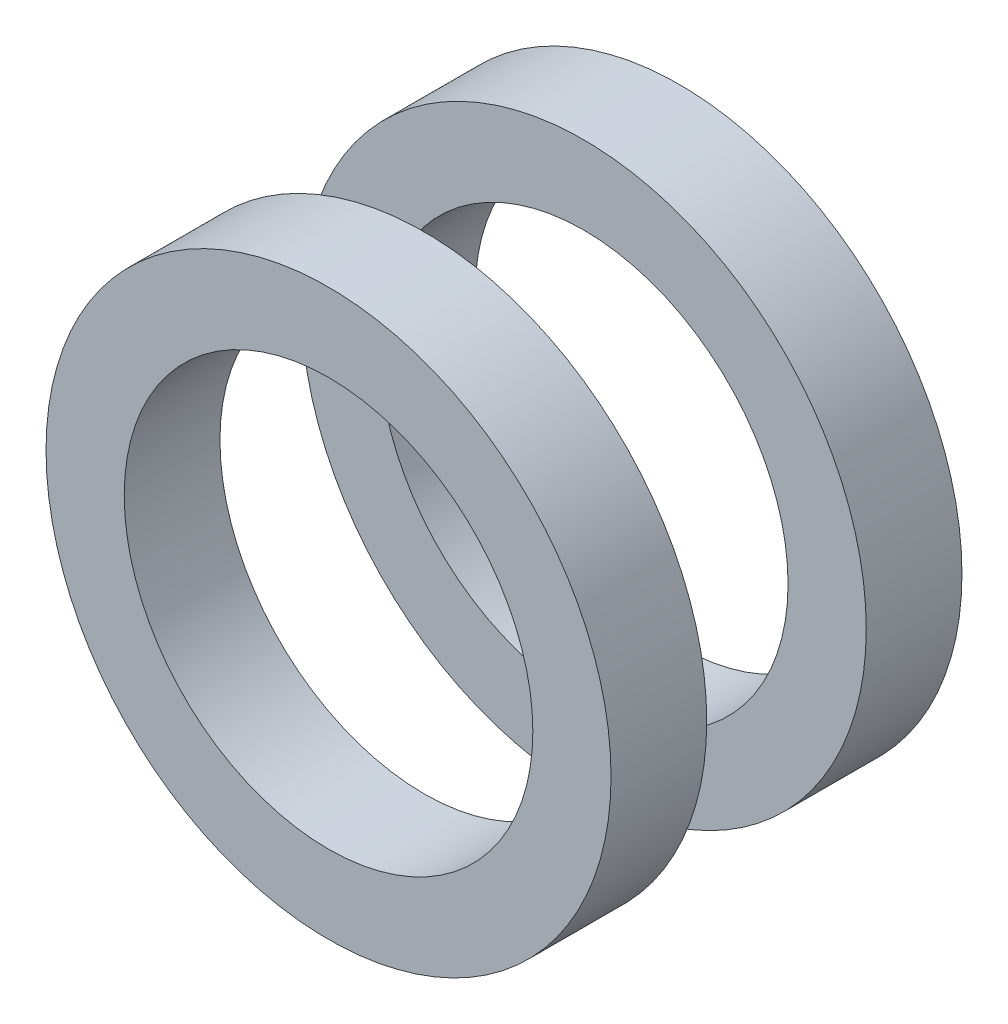
ISO-10303-21;
HEADER;
FILE_DESCRIPTION(('STEP AP214'),'2;1');
FILE_NAME('part.step','',(''),(''),'','','');
FILE_SCHEMA(('AUTOMOTIVE_DESIGN { 1 0 10303 214 1 1 1 1 }'));
ENDSEC;
DATA;
#1=APPLICATION_CONTEXT('core data for automotive mechanical design processes');
#2=APPLICATION_PROTOCOL_DEFINITION('international standard','automotive_design',2000,#1);
#3=PRODUCT_CONTEXT('',#1,'mechanical');
#4=PRODUCT('Part','Part','',(#3));
#5=PRODUCT_RELATED_PRODUCT_CATEGORY('part','',(#4));
#6=PRODUCT_DEFINITION_FORMATION('','',#4);
#7=PRODUCT_DEFINITION_CONTEXT('part definition',#1,'design');
#8=PRODUCT_DEFINITION('design','',#6,#7);
#9=PRODUCT_DEFINITION_SHAPE('','',#8);
#10=(LENGTH_UNIT() NAMED_UNIT(*) SI_UNIT(.MILLI.,.METRE.));
#11=(NAMED_UNIT(*) PLANE_ANGLE_UNIT() SI_UNIT($,.RADIAN.));
#12=(NAMED_UNIT(*) SI_UNIT($,.STERADIAN.) SOLID_ANGLE_UNIT());
#13=UNCERTAINTY_MEASURE_WITH_UNIT(LENGTH_MEASURE(1.E-05),#10,'distance_accuracy_value','');
#14=(GEOMETRIC_REPRESENTATION_CONTEXT(3) GLOBAL_UNCERTAINTY_ASSIGNED_CONTEXT((#13)) GLOBAL_UNIT_ASSIGNED_CONTEXT((#10,
#11,#12)) REPRESENTATION_CONTEXT('',''));
#15=CARTESIAN_POINT('',(0.,0.,0.));
#16=DIRECTION('',(0.,0.,1.));
#17=DIRECTION('',(1.,0.,0.));
#18=AXIS2_PLACEMENT_3D('',#15,#16,#17);
#19=CARTESIAN_POINT('',(0.,0.,-15.));
#20=DIRECTION('',(0.,0.,1.));
#21=DIRECTION('',(1.,0.,0.));
#22=AXIS2_PLACEMENT_3D('',#19,#20,#21);
#23=PLANE('',#22);
#24=CARTESIAN_POINT('',(0.,0.,-15.));
#25=DIRECTION('',(0.,0.,1.));
#26=DIRECTION('',(1.,0.,0.));
#27=AXIS2_PLACEMENT_3D('',#24,#25,#26);
#28=CIRCLE('',#27,53.1307692307692);
#29=CARTESIAN_POINT('',(53.1307692307692,0.,-15.));
#30=VERTEX_POINT('',#29);
#31=EDGE_CURVE('E11',#30,#30,#28,.T.);
#32=ORIENTED_EDGE('',*,*,#31,.T.);
#33=EDGE_LOOP('',(#32));
#34=FACE_BOUND('',#33,.T.);
#35=CARTESIAN_POINT('',(0.,0.,-15.));
#36=DIRECTION('',(0.,0.,1.));
#37=DIRECTION('',(1.,0.,0.));
#38=AXIS2_PLACEMENT_3D('',#35,#36,#37);
#39=CIRCLE('',#38,38.4230769230769);
#40=CARTESIAN_POINT('',(38.4230769230769,0.,-15.));
#41=VERTEX_POINT('',#40);
#42=EDGE_CURVE('E54',#41,#41,#39,.T.);
#43=ORIENTED_EDGE('',*,*,#42,.F.);
#44=EDGE_LOOP('',(#43));
#45=FACE_BOUND('',#44,.T.);
#46=ADVANCED_FACE('F43',(#34,#45),#23,.T.);
#47=CARTESIAN_POINT('',(0.,0.,-33.));
#48=DIRECTION('',(0.,0.,1.));
#49=DIRECTION('',(1.,0.,0.));
#50=AXIS2_PLACEMENT_3D('',#47,#48,#49);
#51=PLANE('',#50);
#52=CARTESIAN_POINT('',(0.,0.,-33.));
#53=DIRECTION('',(0.,0.,1.));
#54=DIRECTION('',(1.,0.,0.));
#55=AXIS2_PLACEMENT_3D('',#52,#53,#54);
#56=CIRCLE('',#55,53.1307692307692);
#57=CARTESIAN_POINT('',(53.1307692307692,0.,-33.));
#58=VERTEX_POINT('',#57);
#59=EDGE_CURVE('E47',#58,#58,#56,.T.);
#60=ORIENTED_EDGE('',*,*,#59,.F.);
#61=EDGE_LOOP('',(#60));
#62=FACE_BOUND('',#61,.T.);
#63=CARTESIAN_POINT('',(0.,0.,-33.));
#64=DIRECTION('',(0.,0.,1.));
#65=DIRECTION('',(1.,0.,0.));
#66=AXIS2_PLACEMENT_3D('',#63,#64,#65);
#67=CIRCLE('',#66,38.4230769230769);
#68=CARTESIAN_POINT('',(38.4230769230769,0.,-33.));
#69=VERTEX_POINT('',#68);
#70=EDGE_CURVE('E56',#69,#69,#67,.T.);
#71=ORIENTED_EDGE('',*,*,#70,.T.);
#72=EDGE_LOOP('',(#71));
#73=FACE_BOUND('',#72,.T.);
#74=ADVANCED_FACE('F66',(#62,#73),#51,.F.);
#75=CARTESIAN_POINT('',(0.,0.,-15.));
#76=DIRECTION('',(0.,0.,-1.));
#77=DIRECTION('',(-1.,0.,0.));
#78=AXIS2_PLACEMENT_3D('',#75,#76,#77);
#79=CYLINDRICAL_SURFACE('',#78,53.1307692307692);
#80=ORIENTED_EDGE('',*,*,#31,.F.);
#81=EDGE_LOOP('',(#80));
#82=FACE_BOUND('',#81,.T.);
#83=ORIENTED_EDGE('',*,*,#59,.T.);
#84=EDGE_LOOP('',(#83));
#85=FACE_BOUND('',#84,.T.);
#86=ADVANCED_FACE('F45',(#82,#85),#79,.T.);
#87=CARTESIAN_POINT('',(0.,0.,-15.));
#88=DIRECTION('',(0.,0.,-1.));
#89=DIRECTION('',(-1.,0.,0.));
#90=AXIS2_PLACEMENT_3D('',#87,#88,#89);
#91=CYLINDRICAL_SURFACE('',#90,38.4230769230769);
#92=ORIENTED_EDGE('',*,*,#42,.T.);
#93=EDGE_LOOP('',(#92));
#94=FACE_BOUND('',#93,.T.);
#95=ORIENTED_EDGE('',*,*,#70,.F.);
#96=EDGE_LOOP('',(#95));
#97=FACE_BOUND('',#96,.T.);
#98=ADVANCED_FACE('F62',(#94,#97),#91,.F.);
#99=CLOSED_SHELL('',(#46,#74,#86,#98));
#100=MANIFOLD_SOLID_BREP('B2',#99);
#101=CARTESIAN_POINT('',(0.,0.,33.));
#102=DIRECTION('',(0.,0.,1.));
#103=DIRECTION('',(1.,0.,0.));
#104=AXIS2_PLACEMENT_3D('',#101,#102,#103);
#105=PLANE('',#104);
#106=CARTESIAN_POINT('',(0.,0.,33.));
#107=DIRECTION('',(0.,0.,1.));
#108=DIRECTION('',(1.,0.,0.));
#109=AXIS2_PLACEMENT_3D('',#106,#107,#108);
#110=CIRCLE('',#109,53.1307692307692);
#111=CARTESIAN_POINT('',(53.1307692307692,0.,33.));
#112=VERTEX_POINT('',#111);
#113=EDGE_CURVE('E42',#112,#112,#110,.T.);
#114=ORIENTED_EDGE('',*,*,#113,.T.);
#115=EDGE_LOOP('',(#114));
#116=FACE_BOUND('',#115,.T.);
#117=CARTESIAN_POINT('',(0.,0.,33.));
#118=DIRECTION('',(0.,0.,1.));
#119=DIRECTION('',(1.,0.,0.));
#120=AXIS2_PLACEMENT_3D('',#117,#118,#119);
#121=CIRCLE('',#120,38.4230769230769);
#122=CARTESIAN_POINT('',(38.4230769230769,0.,33.));
#123=VERTEX_POINT('',#122);
#124=EDGE_CURVE('E116',#123,#123,#121,.T.);
#125=ORIENTED_EDGE('',*,*,#124,.F.);
#126=EDGE_LOOP('',(#125));
#127=FACE_BOUND('',#126,.T.);
#128=ADVANCED_FACE('F105',(#116,#127),#105,.T.);
#129=CARTESIAN_POINT('',(0.,0.,15.));
#130=DIRECTION('',(0.,0.,1.));
#131=DIRECTION('',(1.,0.,0.));
#132=AXIS2_PLACEMENT_3D('',#129,#130,#131);
#133=PLANE('',#132);
#134=CARTESIAN_POINT('',(0.,0.,15.));
#135=DIRECTION('',(0.,0.,1.));
#136=DIRECTION('',(1.,0.,0.));
#137=AXIS2_PLACEMENT_3D('',#134,#135,#136);
#138=CIRCLE('',#137,53.1307692307692);
#139=CARTESIAN_POINT('',(53.1307692307692,0.,15.));
#140=VERTEX_POINT('',#139);
#141=EDGE_CURVE('E109',#140,#140,#138,.T.);
#142=ORIENTED_EDGE('',*,*,#141,.F.);
#143=EDGE_LOOP('',(#142));
#144=FACE_BOUND('',#143,.T.);
#145=CARTESIAN_POINT('',(0.,0.,15.));
#146=DIRECTION('',(0.,0.,1.));
#147=DIRECTION('',(1.,0.,0.));
#148=AXIS2_PLACEMENT_3D('',#145,#146,#147);
#149=CIRCLE('',#148,38.4230769230769);
#150=CARTESIAN_POINT('',(38.4230769230769,0.,15.));
#151=VERTEX_POINT('',#150);
#152=EDGE_CURVE('E118',#151,#151,#149,.T.);
#153=ORIENTED_EDGE('',*,*,#152,.T.);
#154=EDGE_LOOP('',(#153));
#155=FACE_BOUND('',#154,.T.);
#156=ADVANCED_FACE('F128',(#144,#155),#133,.F.);
#157=CARTESIAN_POINT('',(0.,0.,33.));
#158=DIRECTION('',(0.,0.,-1.));
#159=DIRECTION('',(-1.,0.,0.));
#160=AXIS2_PLACEMENT_3D('',#157,#158,#159);
#161=CYLINDRICAL_SURFACE('',#160,53.1307692307692);
#162=ORIENTED_EDGE('',*,*,#113,.F.);
#163=EDGE_LOOP('',(#162));
#164=FACE_BOUND('',#163,.T.);
#165=ORIENTED_EDGE('',*,*,#141,.T.);
#166=EDGE_LOOP('',(#165));
#167=FACE_BOUND('',#166,.T.);
#168=ADVANCED_FACE('F107',(#164,#167),#161,.T.);
#169=CARTESIAN_POINT('',(0.,0.,33.));
#170=DIRECTION('',(0.,0.,-1.));
#171=DIRECTION('',(-1.,0.,0.));
#172=AXIS2_PLACEMENT_3D('',#169,#170,#171);
#173=CYLINDRICAL_SURFACE('',#172,38.4230769230769);
#174=ORIENTED_EDGE('',*,*,#124,.T.);
#175=EDGE_LOOP('',(#174));
#176=FACE_BOUND('',#175,.T.);
#177=ORIENTED_EDGE('',*,*,#152,.F.);
#178=EDGE_LOOP('',(#177));
#179=FACE_BOUND('',#178,.T.);
#180=ADVANCED_FACE('F124',(#176,#179),#173,.F.);
#181=CLOSED_SHELL('',(#128,#156,#168,#180));
#182=MANIFOLD_SOLID_BREP('B6',#181);
#183=ADVANCED_BREP_SHAPE_REPRESENTATION('',(#18,#100,#182),#14);
#184=SHAPE_DEFINITION_REPRESENTATION(#9,#183);
ENDSEC;
END-ISO-10303-21;
